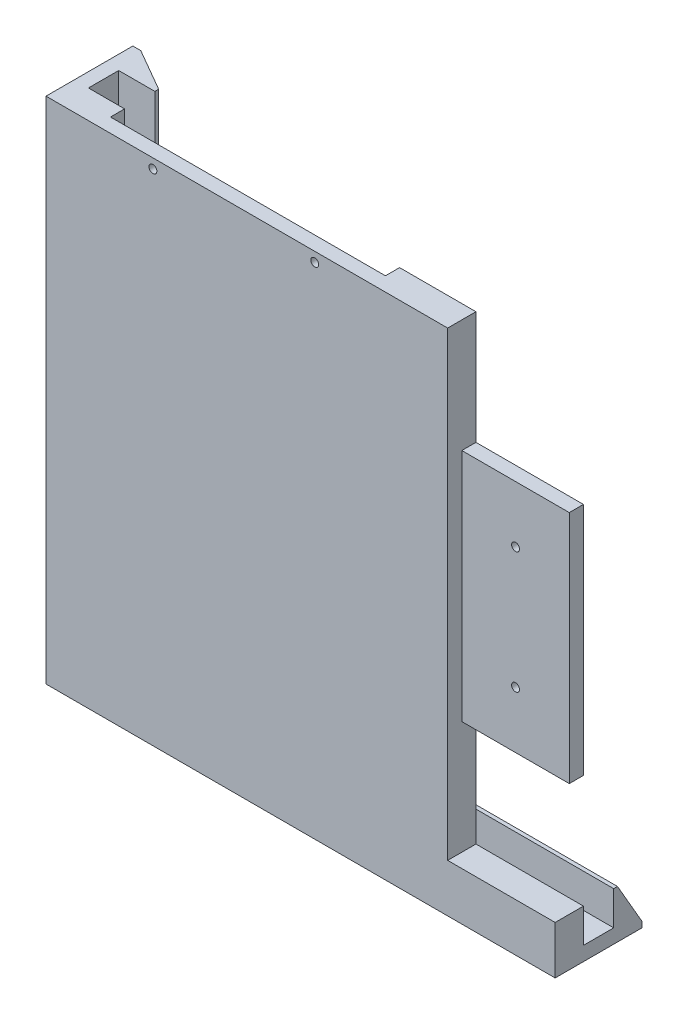
ISO-10303-21;
HEADER;
FILE_DESCRIPTION(('STEP AP214'),'2;1');
FILE_NAME('part.step','',(''),(''),'','','');
FILE_SCHEMA(('AUTOMOTIVE_DESIGN { 1 0 10303 214 1 1 1 1 }'));
ENDSEC;
DATA;
#1=APPLICATION_CONTEXT('core data for automotive mechanical design processes');
#2=APPLICATION_PROTOCOL_DEFINITION('international standard','automotive_design',2000,#1);
#3=PRODUCT_CONTEXT('',#1,'mechanical');
#4=PRODUCT('Part','Part','',(#3));
#5=PRODUCT_RELATED_PRODUCT_CATEGORY('part','',(#4));
#6=PRODUCT_DEFINITION_FORMATION('','',#4);
#7=PRODUCT_DEFINITION_CONTEXT('part definition',#1,'design');
#8=PRODUCT_DEFINITION('design','',#6,#7);
#9=PRODUCT_DEFINITION_SHAPE('','',#8);
#10=(LENGTH_UNIT() NAMED_UNIT(*) SI_UNIT(.MILLI.,.METRE.));
#11=(NAMED_UNIT(*) PLANE_ANGLE_UNIT() SI_UNIT($,.RADIAN.));
#12=(NAMED_UNIT(*) SI_UNIT($,.STERADIAN.) SOLID_ANGLE_UNIT());
#13=UNCERTAINTY_MEASURE_WITH_UNIT(LENGTH_MEASURE(1.E-05),#10,'distance_accuracy_value','');
#14=(GEOMETRIC_REPRESENTATION_CONTEXT(3) GLOBAL_UNCERTAINTY_ASSIGNED_CONTEXT((#13)) GLOBAL_UNIT_ASSIGNED_CONTEXT((#10,
#11,#12)) REPRESENTATION_CONTEXT('',''));
#15=CARTESIAN_POINT('',(0.,0.,0.));
#16=DIRECTION('',(0.,0.,1.));
#17=DIRECTION('',(1.,0.,0.));
#18=AXIS2_PLACEMENT_3D('',#15,#16,#17);
#19=CARTESIAN_POINT('',(180.,0.,30.7));
#20=DIRECTION('',(-1.,0.,0.));
#21=DIRECTION('',(0.,0.,1.));
#22=AXIS2_PLACEMENT_3D('',#19,#20,#21);
#23=PLANE('',#22);
#24=DIRECTION('',(0.,1.,0.));
#25=VECTOR('',#24,1.);
#26=CARTESIAN_POINT('',(180.,0.,0.));
#27=LINE('',#26,#25);
#28=CARTESIAN_POINT('',(180.,0.,0.));
#29=VERTEX_POINT('',#28);
#30=CARTESIAN_POINT('',(180.,2.0099999999999,0.));
#31=VERTEX_POINT('',#30);
#32=EDGE_CURVE('E335',#29,#31,#27,.T.);
#33=ORIENTED_EDGE('',*,*,#32,.T.);
#34=DIRECTION('',(0.,0.86602540378444,0.499999999999997));
#35=VECTOR('',#34,1.);
#36=CARTESIAN_POINT('',(180.,17.01,8.66025403784437));
#37=LINE('',#36,#35);
#38=CARTESIAN_POINT('',(180.,17.01,8.66025403784437));
#39=VERTEX_POINT('',#38);
#40=EDGE_CURVE('E12',#31,#39,#37,.T.);
#41=ORIENTED_EDGE('',*,*,#40,.T.);
#42=DIRECTION('',(0.,0.,-1.));
#43=VECTOR('',#42,1.);
#44=CARTESIAN_POINT('',(180.,17.01,20.7));
#45=LINE('',#44,#43);
#46=CARTESIAN_POINT('',(180.,17.01,10.));
#47=VERTEX_POINT('',#46);
#48=EDGE_CURVE('E309',#47,#39,#45,.T.);
#49=ORIENTED_EDGE('',*,*,#48,.F.);
#50=DIRECTION('',(0.,1.,0.));
#51=VECTOR('',#50,1.);
#52=CARTESIAN_POINT('',(180.,-175.326809130834,10.));
#53=LINE('',#52,#51);
#54=CARTESIAN_POINT('',(180.,5.,10.));
#55=VERTEX_POINT('',#54);
#56=EDGE_CURVE('E292',#55,#47,#53,.T.);
#57=ORIENTED_EDGE('',*,*,#56,.F.);
#58=DIRECTION('',(0.,0.,1.));
#59=VECTOR('',#58,1.);
#60=CARTESIAN_POINT('',(180.,5.,20.7));
#61=LINE('',#60,#59);
#62=CARTESIAN_POINT('',(180.,5.,20.7));
#63=VERTEX_POINT('',#62);
#64=EDGE_CURVE('E284',#55,#63,#61,.T.);
#65=ORIENTED_EDGE('',*,*,#64,.T.);
#66=DIRECTION('',(0.,-1.,0.));
#67=VECTOR('',#66,1.);
#68=CARTESIAN_POINT('',(180.,17.01,20.7));
#69=LINE('',#68,#67);
#70=CARTESIAN_POINT('',(180.,17.01,20.7));
#71=VERTEX_POINT('',#70);
#72=EDGE_CURVE('E303',#71,#63,#69,.T.);
#73=ORIENTED_EDGE('',*,*,#72,.F.);
#74=DIRECTION('',(0.,0.,-1.));
#75=VECTOR('',#74,1.);
#76=CARTESIAN_POINT('',(180.,17.01,30.7));
#77=LINE('',#76,#75);
#78=CARTESIAN_POINT('',(180.,17.01,30.7));
#79=VERTEX_POINT('',#78);
#80=EDGE_CURVE('E274',#79,#71,#77,.T.);
#81=ORIENTED_EDGE('',*,*,#80,.F.);
#82=DIRECTION('',(0.,1.,0.));
#83=VECTOR('',#82,1.);
#84=CARTESIAN_POINT('',(180.,0.,30.7));
#85=LINE('',#84,#83);
#86=CARTESIAN_POINT('',(180.,0.,30.7));
#87=VERTEX_POINT('',#86);
#88=EDGE_CURVE('E325',#87,#79,#85,.T.);
#89=ORIENTED_EDGE('',*,*,#88,.F.);
#90=DIRECTION('',(0.,0.,-1.));
#91=VECTOR('',#90,1.);
#92=CARTESIAN_POINT('',(180.,0.,30.7));
#93=LINE('',#92,#91);
#94=EDGE_CURVE('E340',#87,#29,#93,.T.);
#95=ORIENTED_EDGE('',*,*,#94,.T.);
#96=EDGE_LOOP('',(#33,#41,#49,#57,#65,#73,#81,#89,#95));
#97=FACE_BOUND('',#96,.T.);
#98=ADVANCED_FACE('F41',(#97),#23,.F.);
#99=CARTESIAN_POINT('',(0.,0.,30.7));
#100=DIRECTION('',(1.,0.,0.));
#101=DIRECTION('',(0.,0.,-1.));
#102=AXIS2_PLACEMENT_3D('',#99,#100,#101);
#103=PLANE('',#102);
#104=DIRECTION('',(0.,-1.,0.));
#105=VECTOR('',#104,1.);
#106=CARTESIAN_POINT('',(0.,0.,0.));
#107=LINE('',#106,#105);
#108=CARTESIAN_POINT('',(0.,180.,0.));
#109=VERTEX_POINT('',#108);
#110=CARTESIAN_POINT('',(0.,0.,0.));
#111=VERTEX_POINT('',#110);
#112=EDGE_CURVE('E314',#109,#111,#107,.T.);
#113=ORIENTED_EDGE('',*,*,#112,.T.);
#114=DIRECTION('',(0.,0.,-1.));
#115=VECTOR('',#114,1.);
#116=CARTESIAN_POINT('',(0.,0.,30.7));
#117=LINE('',#116,#115);
#118=CARTESIAN_POINT('',(0.,0.,30.7));
#119=VERTEX_POINT('',#118);
#120=EDGE_CURVE('E343',#119,#111,#117,.T.);
#121=ORIENTED_EDGE('',*,*,#120,.F.);
#122=DIRECTION('',(0.,-1.,0.));
#123=VECTOR('',#122,1.);
#124=CARTESIAN_POINT('',(0.,0.,30.7));
#125=LINE('',#124,#123);
#126=CARTESIAN_POINT('',(0.,180.,30.7));
#127=VERTEX_POINT('',#126);
#128=EDGE_CURVE('E319',#127,#119,#125,.T.);
#129=ORIENTED_EDGE('',*,*,#128,.F.);
#130=DIRECTION('',(0.,0.,-1.));
#131=VECTOR('',#130,1.);
#132=CARTESIAN_POINT('',(0.,180.,30.7));
#133=LINE('',#132,#131);
#134=EDGE_CURVE('E330',#127,#109,#133,.T.);
#135=ORIENTED_EDGE('',*,*,#134,.T.);
#136=EDGE_LOOP('',(#113,#121,#129,#135));
#137=FACE_BOUND('',#136,.T.);
#138=ADVANCED_FACE('F396',(#137),#103,.F.);
#139=CARTESIAN_POINT('',(0.,0.,30.7));
#140=DIRECTION('',(0.,1.,0.));
#141=DIRECTION('',(0.,0.,1.));
#142=AXIS2_PLACEMENT_3D('',#139,#140,#141);
#143=PLANE('',#142);
#144=DIRECTION('',(1.,0.,0.));
#145=VECTOR('',#144,1.);
#146=CARTESIAN_POINT('',(0.,0.,0.));
#147=LINE('',#146,#145);
#148=EDGE_CURVE('E333',#111,#29,#147,.T.);
#149=ORIENTED_EDGE('',*,*,#148,.T.);
#150=ORIENTED_EDGE('',*,*,#94,.F.);
#151=DIRECTION('',(1.,0.,0.));
#152=VECTOR('',#151,1.);
#153=CARTESIAN_POINT('',(0.,0.,30.7));
#154=LINE('',#153,#152);
#155=EDGE_CURVE('E322',#119,#87,#154,.T.);
#156=ORIENTED_EDGE('',*,*,#155,.F.);
#157=ORIENTED_EDGE('',*,*,#120,.T.);
#158=EDGE_LOOP('',(#149,#150,#156,#157));
#159=FACE_BOUND('',#158,.T.);
#160=ADVANCED_FACE('F404',(#159),#143,.F.);
#161=DIRECTION('',(0.,0.,-1.));
#162=VECTOR('',#161,1.);
#163=CARTESIAN_POINT('',(180.,140.,30.7));
#164=LINE('',#163,#162);
#165=CARTESIAN_POINT('',(180.,140.,25.7));
#166=VERTEX_POINT('',#165);
#167=CARTESIAN_POINT('',(180.,140.,20.7));
#168=VERTEX_POINT('',#167);
#169=EDGE_CURVE('E257',#166,#168,#164,.T.);
#170=ORIENTED_EDGE('',*,*,#169,.F.);
#171=DIRECTION('',(0.,1.,0.));
#172=VECTOR('',#171,1.);
#173=CARTESIAN_POINT('',(180.,140.,25.7));
#174=LINE('',#173,#172);
#175=CARTESIAN_POINT('',(180.,57.0100000000001,25.7));
#176=VERTEX_POINT('',#175);
#177=EDGE_CURVE('E229',#176,#166,#174,.T.);
#178=ORIENTED_EDGE('',*,*,#177,.F.);
#179=DIRECTION('',(0.,0.,-1.));
#180=VECTOR('',#179,1.);
#181=CARTESIAN_POINT('',(180.,57.0100000000001,30.7));
#182=LINE('',#181,#180);
#183=CARTESIAN_POINT('',(180.,57.0100000000001,20.7));
#184=VERTEX_POINT('',#183);
#185=EDGE_CURVE('E276',#176,#184,#182,.T.);
#186=ORIENTED_EDGE('',*,*,#185,.T.);
#187=EDGE_CURVE('E305',#168,#184,#69,.T.);
#188=ORIENTED_EDGE('',*,*,#187,.F.);
#189=EDGE_LOOP('',(#170,#178,#186,#188));
#190=FACE_BOUND('',#189,.T.);
#191=ADVANCED_FACE('F398',(#190),#23,.F.);
#192=CARTESIAN_POINT('',(0.,180.,30.7));
#193=DIRECTION('',(0.,-1.,0.));
#194=DIRECTION('',(0.,0.,-1.));
#195=AXIS2_PLACEMENT_3D('',#192,#193,#194);
#196=PLANE('',#195);
#197=DIRECTION('',(0.,0.,-1.));
#198=VECTOR('',#197,1.);
#199=CARTESIAN_POINT('',(17.79,180.,20.7));
#200=LINE('',#199,#198);
#201=CARTESIAN_POINT('',(17.79,180.,10.));
#202=VERTEX_POINT('',#201);
#203=CARTESIAN_POINT('',(17.79,180.,8.66025403784437));
#204=VERTEX_POINT('',#203);
#205=EDGE_CURVE('E311',#202,#204,#200,.T.);
#206=ORIENTED_EDGE('',*,*,#205,.T.);
#207=DIRECTION('',(-0.86602540378444,0.,-0.499999999999997));
#208=VECTOR('',#207,1.);
#209=CARTESIAN_POINT('',(17.79,180.,8.66025403784437));
#210=LINE('',#209,#208);
#211=CARTESIAN_POINT('',(2.7899999999999,180.,0.));
#212=VERTEX_POINT('',#211);
#213=EDGE_CURVE('E352',#204,#212,#210,.T.);
#214=ORIENTED_EDGE('',*,*,#213,.T.);
#215=DIRECTION('',(-1.,0.,0.));
#216=VECTOR('',#215,1.);
#217=CARTESIAN_POINT('',(0.,180.,0.));
#218=LINE('',#217,#216);
#219=EDGE_CURVE('E323',#212,#109,#218,.T.);
#220=ORIENTED_EDGE('',*,*,#219,.T.);
#221=ORIENTED_EDGE('',*,*,#134,.F.);
#222=DIRECTION('',(-1.,0.,0.));
#223=VECTOR('',#222,1.);
#224=CARTESIAN_POINT('',(0.,180.,30.7));
#225=LINE('',#224,#223);
#226=CARTESIAN_POINT('',(142.,180.,30.7));
#227=VERTEX_POINT('',#226);
#228=EDGE_CURVE('E328',#227,#127,#225,.T.);
#229=ORIENTED_EDGE('',*,*,#228,.F.);
#230=DIRECTION('',(0.,0.,-1.));
#231=VECTOR('',#230,1.);
#232=CARTESIAN_POINT('',(142.,180.,30.7));
#233=LINE('',#232,#231);
#234=CARTESIAN_POINT('',(142.,180.,20.7));
#235=VERTEX_POINT('',#234);
#236=EDGE_CURVE('E246',#227,#235,#233,.T.);
#237=ORIENTED_EDGE('',*,*,#236,.T.);
#238=DIRECTION('',(1.,0.,0.));
#239=VECTOR('',#238,1.);
#240=CARTESIAN_POINT('',(180.,180.,20.7));
#241=LINE('',#240,#239);
#242=CARTESIAN_POINT('',(115.,180.,20.7));
#243=VERTEX_POINT('',#242);
#244=EDGE_CURVE('E310',#243,#235,#241,.T.);
#245=ORIENTED_EDGE('',*,*,#244,.F.);
#246=DIRECTION('',(0.,0.,-1.));
#247=VECTOR('',#246,1.);
#248=CARTESIAN_POINT('',(115.,180.,25.7));
#249=LINE('',#248,#247);
#250=CARTESIAN_POINT('',(115.,180.,25.7));
#251=VERTEX_POINT('',#250);
#252=EDGE_CURVE('E227',#251,#243,#249,.T.);
#253=ORIENTED_EDGE('',*,*,#252,.F.);
#254=DIRECTION('',(1.,0.,0.));
#255=VECTOR('',#254,1.);
#256=CARTESIAN_POINT('',(115.,180.,25.7));
#257=LINE('',#256,#255);
#258=CARTESIAN_POINT('',(17.79,180.,25.7));
#259=VERTEX_POINT('',#258);
#260=EDGE_CURVE('E201',#259,#251,#257,.T.);
#261=ORIENTED_EDGE('',*,*,#260,.F.);
#262=DIRECTION('',(0.,0.,-1.));
#263=VECTOR('',#262,1.);
#264=CARTESIAN_POINT('',(17.79,180.,25.7));
#265=LINE('',#264,#263);
#266=CARTESIAN_POINT('',(17.79,180.,20.7));
#267=VERTEX_POINT('',#266);
#268=EDGE_CURVE('E230',#259,#267,#265,.T.);
#269=ORIENTED_EDGE('',*,*,#268,.T.);
#270=CARTESIAN_POINT('',(5.,180.,20.7));
#271=VERTEX_POINT('',#270);
#272=EDGE_CURVE('E306',#271,#267,#241,.T.);
#273=ORIENTED_EDGE('',*,*,#272,.F.);
#274=DIRECTION('',(0.,0.,1.));
#275=VECTOR('',#274,1.);
#276=CARTESIAN_POINT('',(5.,180.,20.7));
#277=LINE('',#276,#275);
#278=CARTESIAN_POINT('',(5.,180.,10.));
#279=VERTEX_POINT('',#278);
#280=EDGE_CURVE('E289',#279,#271,#277,.T.);
#281=ORIENTED_EDGE('',*,*,#280,.F.);
#282=DIRECTION('',(-1.,0.,0.));
#283=VECTOR('',#282,1.);
#284=CARTESIAN_POINT('',(180.,180.,10.));
#285=LINE('',#284,#283);
#286=EDGE_CURVE('E256',#202,#279,#285,.T.);
#287=ORIENTED_EDGE('',*,*,#286,.F.);
#288=EDGE_LOOP('',(#206,#214,#220,#221,#229,#237,#245,#253,#261,#269,#273,#281,#287));
#289=FACE_BOUND('',#288,.T.);
#290=ADVANCED_FACE('F410',(#289),#196,.F.);
#291=CARTESIAN_POINT('',(0.,0.,30.7));
#292=DIRECTION('',(0.,0.,-1.));
#293=DIRECTION('',(-1.,0.,0.));
#294=AXIS2_PLACEMENT_3D('',#291,#292,#293);
#295=PLANE('',#294);
#296=CARTESIAN_POINT('',(37.79,176.6,30.7));
#297=DIRECTION('',(0.,0.,-1.));
#298=DIRECTION('',(-1.,0.,0.));
#299=AXIS2_PLACEMENT_3D('',#296,#297,#298);
#300=CIRCLE('',#299,1.40000000000001);
#301=CARTESIAN_POINT('',(36.39,176.6,30.7));
#302=VERTEX_POINT('',#301);
#303=EDGE_CURVE('E219',#302,#302,#300,.T.);
#304=ORIENTED_EDGE('',*,*,#303,.T.);
#305=EDGE_LOOP('',(#304));
#306=FACE_BOUND('',#305,.T.);
#307=CARTESIAN_POINT('',(95.,176.6,30.7));
#308=DIRECTION('',(0.,0.,-1.));
#309=DIRECTION('',(-1.,0.,0.));
#310=AXIS2_PLACEMENT_3D('',#307,#308,#309);
#311=CIRCLE('',#310,1.40000000000002);
#312=CARTESIAN_POINT('',(93.6,176.6,30.7));
#313=VERTEX_POINT('',#312);
#314=EDGE_CURVE('E363',#313,#313,#311,.T.);
#315=ORIENTED_EDGE('',*,*,#314,.T.);
#316=EDGE_LOOP('',(#315));
#317=FACE_BOUND('',#316,.T.);
#318=DIRECTION('',(-1.,0.,0.));
#319=VECTOR('',#318,1.);
#320=CARTESIAN_POINT('',(142.,17.01,30.7));
#321=LINE('',#320,#319);
#322=CARTESIAN_POINT('',(142.,17.01,30.7));
#323=VERTEX_POINT('',#322);
#324=EDGE_CURVE('E261',#79,#323,#321,.T.);
#325=ORIENTED_EDGE('',*,*,#324,.T.);
#326=DIRECTION('',(0.,1.,0.));
#327=VECTOR('',#326,1.);
#328=CARTESIAN_POINT('',(142.,140.,30.7));
#329=LINE('',#328,#327);
#330=EDGE_CURVE('E243',#323,#227,#329,.T.);
#331=ORIENTED_EDGE('',*,*,#330,.T.);
#332=ORIENTED_EDGE('',*,*,#228,.T.);
#333=ORIENTED_EDGE('',*,*,#128,.T.);
#334=ORIENTED_EDGE('',*,*,#155,.T.);
#335=ORIENTED_EDGE('',*,*,#88,.T.);
#336=EDGE_LOOP('',(#325,#331,#332,#333,#334,#335));
#337=FACE_BOUND('',#336,.T.);
#338=ADVANCED_FACE('F375',(#306,#317,#337),#295,.F.);
#339=CARTESIAN_POINT('',(0.,0.,0.));
#340=DIRECTION('',(0.,0.,-1.));
#341=DIRECTION('',(-1.,0.,0.));
#342=AXIS2_PLACEMENT_3D('',#339,#340,#341);
#343=PLANE('',#342);
#344=ORIENTED_EDGE('',*,*,#219,.F.);
#345=DIRECTION('',(0.,-1.,0.));
#346=VECTOR('',#345,1.);
#347=CARTESIAN_POINT('',(2.7899999999999,17.01,0.));
#348=LINE('',#347,#346);
#349=CARTESIAN_POINT('',(2.7899999999999,2.0099999999999,0.));
#350=VERTEX_POINT('',#349);
#351=EDGE_CURVE('E64',#212,#350,#348,.T.);
#352=ORIENTED_EDGE('',*,*,#351,.T.);
#353=DIRECTION('',(1.,0.,0.));
#354=VECTOR('',#353,1.);
#355=CARTESIAN_POINT('',(180.,2.0099999999999,0.));
#356=LINE('',#355,#354);
#357=EDGE_CURVE('E354',#350,#31,#356,.T.);
#358=ORIENTED_EDGE('',*,*,#357,.T.);
#359=ORIENTED_EDGE('',*,*,#32,.F.);
#360=ORIENTED_EDGE('',*,*,#148,.F.);
#361=ORIENTED_EDGE('',*,*,#112,.F.);
#362=EDGE_LOOP('',(#344,#352,#358,#359,#360,#361));
#363=FACE_BOUND('',#362,.T.);
#364=ADVANCED_FACE('F492',(#363),#343,.T.);
#365=CARTESIAN_POINT('',(17.79,17.01,20.7));
#366=DIRECTION('',(-1.,0.,0.));
#367=DIRECTION('',(0.,0.,1.));
#368=AXIS2_PLACEMENT_3D('',#365,#366,#367);
#369=PLANE('',#368);
#370=DIRECTION('',(0.,0.,-1.));
#371=VECTOR('',#370,1.);
#372=CARTESIAN_POINT('',(17.79,17.01,20.7));
#373=LINE('',#372,#371);
#374=CARTESIAN_POINT('',(17.79,17.01,10.));
#375=VERTEX_POINT('',#374);
#376=CARTESIAN_POINT('',(17.79,17.01,8.66025403784437));
#377=VERTEX_POINT('',#376);
#378=EDGE_CURVE('E315',#375,#377,#373,.T.);
#379=ORIENTED_EDGE('',*,*,#378,.T.);
#380=DIRECTION('',(0.,1.,0.));
#381=VECTOR('',#380,1.);
#382=CARTESIAN_POINT('',(17.79,180.,8.66025403784437));
#383=LINE('',#382,#381);
#384=EDGE_CURVE('E349',#377,#204,#383,.T.);
#385=ORIENTED_EDGE('',*,*,#384,.T.);
#386=ORIENTED_EDGE('',*,*,#205,.F.);
#387=DIRECTION('',(0.,-1.,0.));
#388=VECTOR('',#387,1.);
#389=CARTESIAN_POINT('',(17.79,17.01,10.));
#390=LINE('',#389,#388);
#391=EDGE_CURVE('E300',#202,#375,#390,.T.);
#392=ORIENTED_EDGE('',*,*,#391,.T.);
#393=EDGE_LOOP('',(#379,#385,#386,#392));
#394=FACE_BOUND('',#393,.T.);
#395=ADVANCED_FACE('F489',(#394),#369,.F.);
#396=CARTESIAN_POINT('',(180.,17.01,20.7));
#397=DIRECTION('',(0.,-1.,0.));
#398=DIRECTION('',(0.,0.,-1.));
#399=AXIS2_PLACEMENT_3D('',#396,#397,#398);
#400=PLANE('',#399);
#401=ORIENTED_EDGE('',*,*,#48,.T.);
#402=DIRECTION('',(-1.,0.,0.));
#403=VECTOR('',#402,1.);
#404=CARTESIAN_POINT('',(17.79,17.01,8.66025403784437));
#405=LINE('',#404,#403);
#406=EDGE_CURVE('E50',#39,#377,#405,.T.);
#407=ORIENTED_EDGE('',*,*,#406,.T.);
#408=ORIENTED_EDGE('',*,*,#378,.F.);
#409=DIRECTION('',(1.,0.,0.));
#410=VECTOR('',#409,1.);
#411=CARTESIAN_POINT('',(180.,17.01,10.));
#412=LINE('',#411,#410);
#413=EDGE_CURVE('E346',#375,#47,#412,.T.);
#414=ORIENTED_EDGE('',*,*,#413,.T.);
#415=EDGE_LOOP('',(#401,#407,#408,#414));
#416=FACE_BOUND('',#415,.T.);
#417=ADVANCED_FACE('F487',(#416),#400,.F.);
#418=CARTESIAN_POINT('',(0.,0.,20.7));
#419=DIRECTION('',(0.,0.,1.));
#420=DIRECTION('',(1.,0.,0.));
#421=AXIS2_PLACEMENT_3D('',#418,#419,#420);
#422=PLANE('',#421);
#423=CARTESIAN_POINT('',(161.,120.,20.7));
#424=DIRECTION('',(0.,0.,-1.));
#425=DIRECTION('',(-1.,0.,0.));
#426=AXIS2_PLACEMENT_3D('',#423,#424,#425);
#427=CIRCLE('',#426,1.4);
#428=CARTESIAN_POINT('',(159.6,120.,20.7));
#429=VERTEX_POINT('',#428);
#430=EDGE_CURVE('E364',#429,#429,#427,.T.);
#431=ORIENTED_EDGE('',*,*,#430,.F.);
#432=EDGE_LOOP('',(#431));
#433=FACE_BOUND('',#432,.T.);
#434=CARTESIAN_POINT('',(161.,77.0100000000001,20.7));
#435=DIRECTION('',(0.,0.,-1.));
#436=DIRECTION('',(-1.,0.,0.));
#437=AXIS2_PLACEMENT_3D('',#434,#435,#436);
#438=CIRCLE('',#437,1.40000000000003);
#439=CARTESIAN_POINT('',(159.6,77.0100000000001,20.7));
#440=VERTEX_POINT('',#439);
#441=EDGE_CURVE('E539',#440,#440,#438,.T.);
#442=ORIENTED_EDGE('',*,*,#441,.F.);
#443=EDGE_LOOP('',(#442));
#444=FACE_BOUND('',#443,.T.);
#445=DIRECTION('',(-1.,0.,0.));
#446=VECTOR('',#445,1.);
#447=CARTESIAN_POINT('',(115.,173.2,20.7));
#448=LINE('',#447,#446);
#449=CARTESIAN_POINT('',(115.,173.2,20.7));
#450=VERTEX_POINT('',#449);
#451=CARTESIAN_POINT('',(17.79,173.2,20.7));
#452=VERTEX_POINT('',#451);
#453=EDGE_CURVE('E216',#450,#452,#448,.T.);
#454=ORIENTED_EDGE('',*,*,#453,.F.);
#455=DIRECTION('',(0.,-1.,0.));
#456=VECTOR('',#455,1.);
#457=CARTESIAN_POINT('',(115.,173.2,20.7));
#458=LINE('',#457,#456);
#459=EDGE_CURVE('E196',#243,#450,#458,.T.);
#460=ORIENTED_EDGE('',*,*,#459,.F.);
#461=ORIENTED_EDGE('',*,*,#244,.T.);
#462=DIRECTION('',(0.,1.,0.));
#463=VECTOR('',#462,1.);
#464=CARTESIAN_POINT('',(142.,140.,20.7));
#465=LINE('',#464,#463);
#466=CARTESIAN_POINT('',(142.,140.,20.7));
#467=VERTEX_POINT('',#466);
#468=EDGE_CURVE('E248',#467,#235,#465,.T.);
#469=ORIENTED_EDGE('',*,*,#468,.F.);
#470=DIRECTION('',(-1.,0.,0.));
#471=VECTOR('',#470,1.);
#472=CARTESIAN_POINT('',(142.,140.,20.7));
#473=LINE('',#472,#471);
#474=EDGE_CURVE('E247',#168,#467,#473,.T.);
#475=ORIENTED_EDGE('',*,*,#474,.F.);
#476=ORIENTED_EDGE('',*,*,#187,.T.);
#477=DIRECTION('',(1.,0.,0.));
#478=VECTOR('',#477,1.);
#479=CARTESIAN_POINT('',(142.,57.0100000000001,20.7));
#480=LINE('',#479,#478);
#481=CARTESIAN_POINT('',(142.,57.0100000000001,20.7));
#482=VERTEX_POINT('',#481);
#483=EDGE_CURVE('E268',#482,#184,#480,.T.);
#484=ORIENTED_EDGE('',*,*,#483,.F.);
#485=DIRECTION('',(0.,1.,0.));
#486=VECTOR('',#485,1.);
#487=CARTESIAN_POINT('',(142.,57.0100000000001,20.7));
#488=LINE('',#487,#486);
#489=CARTESIAN_POINT('',(142.,17.01,20.7));
#490=VERTEX_POINT('',#489);
#491=EDGE_CURVE('E242',#490,#482,#488,.T.);
#492=ORIENTED_EDGE('',*,*,#491,.F.);
#493=DIRECTION('',(-1.,0.,0.));
#494=VECTOR('',#493,1.);
#495=CARTESIAN_POINT('',(142.,17.01,20.7));
#496=LINE('',#495,#494);
#497=EDGE_CURVE('E265',#71,#490,#496,.T.);
#498=ORIENTED_EDGE('',*,*,#497,.F.);
#499=ORIENTED_EDGE('',*,*,#72,.T.);
#500=DIRECTION('',(-1.,0.,0.));
#501=VECTOR('',#500,1.);
#502=CARTESIAN_POINT('',(180.,5.,20.7));
#503=LINE('',#502,#501);
#504=CARTESIAN_POINT('',(5.,5.,20.7));
#505=VERTEX_POINT('',#504);
#506=EDGE_CURVE('E281',#63,#505,#503,.T.);
#507=ORIENTED_EDGE('',*,*,#506,.T.);
#508=DIRECTION('',(0.,1.,0.));
#509=VECTOR('',#508,1.);
#510=CARTESIAN_POINT('',(5.,-175.326809130834,20.7));
#511=LINE('',#510,#509);
#512=EDGE_CURVE('E282',#505,#271,#511,.T.);
#513=ORIENTED_EDGE('',*,*,#512,.T.);
#514=ORIENTED_EDGE('',*,*,#272,.T.);
#515=DIRECTION('',(0.,1.,0.));
#516=VECTOR('',#515,1.);
#517=CARTESIAN_POINT('',(17.79,173.2,20.7));
#518=LINE('',#517,#516);
#519=EDGE_CURVE('E214',#452,#267,#518,.T.);
#520=ORIENTED_EDGE('',*,*,#519,.F.);
#521=EDGE_LOOP('',(#454,#460,#461,#469,#475,#476,#484,#492,#498,#499,#507,#513,#514,#520));
#522=FACE_BOUND('',#521,.T.);
#523=ADVANCED_FACE('F431',(#433,#444,#522),#422,.F.);
#524=CARTESIAN_POINT('',(180.,-175.326809130834,10.));
#525=DIRECTION('',(0.,0.,-1.));
#526=DIRECTION('',(-1.,0.,0.));
#527=AXIS2_PLACEMENT_3D('',#524,#525,#526);
#528=PLANE('',#527);
#529=ORIENTED_EDGE('',*,*,#286,.T.);
#530=DIRECTION('',(0.,1.,0.));
#531=VECTOR('',#530,1.);
#532=CARTESIAN_POINT('',(5.,-175.326809130834,10.));
#533=LINE('',#532,#531);
#534=CARTESIAN_POINT('',(5.,4.99999999999995,10.));
#535=VERTEX_POINT('',#534);
#536=EDGE_CURVE('E295',#535,#279,#533,.T.);
#537=ORIENTED_EDGE('',*,*,#536,.F.);
#538=DIRECTION('',(1.,0.,0.));
#539=VECTOR('',#538,1.);
#540=CARTESIAN_POINT('',(180.,5.,10.));
#541=LINE('',#540,#539);
#542=EDGE_CURVE('E287',#535,#55,#541,.T.);
#543=ORIENTED_EDGE('',*,*,#542,.T.);
#544=ORIENTED_EDGE('',*,*,#56,.T.);
#545=ORIENTED_EDGE('',*,*,#413,.F.);
#546=ORIENTED_EDGE('',*,*,#391,.F.);
#547=EDGE_LOOP('',(#529,#537,#543,#544,#545,#546));
#548=FACE_BOUND('',#547,.T.);
#549=ADVANCED_FACE('F481',(#548),#528,.F.);
#550=CARTESIAN_POINT('',(5.,-175.326809130834,20.7));
#551=DIRECTION('',(-1.,0.,0.));
#552=DIRECTION('',(0.,0.,1.));
#553=AXIS2_PLACEMENT_3D('',#550,#551,#552);
#554=PLANE('',#553);
#555=DIRECTION('',(0.,0.,-1.));
#556=VECTOR('',#555,1.);
#557=CARTESIAN_POINT('',(5.,5.,20.7));
#558=LINE('',#557,#556);
#559=EDGE_CURVE('E279',#505,#535,#558,.T.);
#560=ORIENTED_EDGE('',*,*,#559,.T.);
#561=ORIENTED_EDGE('',*,*,#536,.T.);
#562=ORIENTED_EDGE('',*,*,#280,.T.);
#563=ORIENTED_EDGE('',*,*,#512,.F.);
#564=EDGE_LOOP('',(#560,#561,#562,#563));
#565=FACE_BOUND('',#564,.T.);
#566=ADVANCED_FACE('F477',(#565),#554,.F.);
#567=CARTESIAN_POINT('',(0.,5.,30.7));
#568=DIRECTION('',(0.,1.,0.));
#569=DIRECTION('',(0.,0.,1.));
#570=AXIS2_PLACEMENT_3D('',#567,#568,#569);
#571=PLANE('',#570);
#572=ORIENTED_EDGE('',*,*,#64,.F.);
#573=ORIENTED_EDGE('',*,*,#542,.F.);
#574=ORIENTED_EDGE('',*,*,#559,.F.);
#575=ORIENTED_EDGE('',*,*,#506,.F.);
#576=EDGE_LOOP('',(#572,#573,#574,#575));
#577=FACE_BOUND('',#576,.T.);
#578=ADVANCED_FACE('F472',(#577),#571,.T.);
#579=CARTESIAN_POINT('',(142.,17.01,30.7));
#580=DIRECTION('',(0.,-1.,0.));
#581=DIRECTION('',(0.,0.,-1.));
#582=AXIS2_PLACEMENT_3D('',#579,#580,#581);
#583=PLANE('',#582);
#584=ORIENTED_EDGE('',*,*,#497,.T.);
#585=DIRECTION('',(0.,0.,-1.));
#586=VECTOR('',#585,1.);
#587=CARTESIAN_POINT('',(142.,17.01,30.7));
#588=LINE('',#587,#586);
#589=EDGE_CURVE('E251',#323,#490,#588,.T.);
#590=ORIENTED_EDGE('',*,*,#589,.F.);
#591=ORIENTED_EDGE('',*,*,#324,.F.);
#592=ORIENTED_EDGE('',*,*,#80,.T.);
#593=EDGE_LOOP('',(#584,#590,#591,#592));
#594=FACE_BOUND('',#593,.T.);
#595=ADVANCED_FACE('F443',(#594),#583,.F.);
#596=CARTESIAN_POINT('',(142.,57.0100000000001,30.7));
#597=DIRECTION('',(0.,1.,0.));
#598=DIRECTION('',(0.,0.,1.));
#599=AXIS2_PLACEMENT_3D('',#596,#597,#598);
#600=PLANE('',#599);
#601=ORIENTED_EDGE('',*,*,#185,.F.);
#602=DIRECTION('',(1.,0.,0.));
#603=VECTOR('',#602,1.);
#604=CARTESIAN_POINT('',(180.,57.0100000000001,25.7));
#605=LINE('',#604,#603);
#606=CARTESIAN_POINT('',(142.,57.0100000000001,25.7));
#607=VERTEX_POINT('',#606);
#608=EDGE_CURVE('E240',#607,#176,#605,.T.);
#609=ORIENTED_EDGE('',*,*,#608,.F.);
#610=DIRECTION('',(0.,0.,-1.));
#611=VECTOR('',#610,1.);
#612=CARTESIAN_POINT('',(142.,57.0100000000001,30.7));
#613=LINE('',#612,#611);
#614=EDGE_CURVE('E264',#607,#482,#613,.T.);
#615=ORIENTED_EDGE('',*,*,#614,.T.);
#616=ORIENTED_EDGE('',*,*,#483,.T.);
#617=EDGE_LOOP('',(#601,#609,#615,#616));
#618=FACE_BOUND('',#617,.T.);
#619=ADVANCED_FACE('F451',(#618),#600,.F.);
#620=CARTESIAN_POINT('',(142.,140.,30.7));
#621=DIRECTION('',(-1.,0.,0.));
#622=DIRECTION('',(0.,0.,1.));
#623=AXIS2_PLACEMENT_3D('',#620,#621,#622);
#624=PLANE('',#623);
#625=ORIENTED_EDGE('',*,*,#468,.T.);
#626=ORIENTED_EDGE('',*,*,#236,.F.);
#627=ORIENTED_EDGE('',*,*,#330,.F.);
#628=ORIENTED_EDGE('',*,*,#589,.T.);
#629=ORIENTED_EDGE('',*,*,#491,.T.);
#630=ORIENTED_EDGE('',*,*,#614,.F.);
#631=DIRECTION('',(0.,-1.,0.));
#632=VECTOR('',#631,1.);
#633=CARTESIAN_POINT('',(142.,140.,25.7));
#634=LINE('',#633,#632);
#635=CARTESIAN_POINT('',(142.,140.,25.7));
#636=VERTEX_POINT('',#635);
#637=EDGE_CURVE('E238',#636,#607,#634,.T.);
#638=ORIENTED_EDGE('',*,*,#637,.F.);
#639=DIRECTION('',(0.,0.,-1.));
#640=VECTOR('',#639,1.);
#641=CARTESIAN_POINT('',(142.,140.,30.7));
#642=LINE('',#641,#640);
#643=EDGE_CURVE('E254',#636,#467,#642,.T.);
#644=ORIENTED_EDGE('',*,*,#643,.T.);
#645=EDGE_LOOP('',(#625,#626,#627,#628,#629,#630,#638,#644));
#646=FACE_BOUND('',#645,.T.);
#647=ADVANCED_FACE('F435',(#646),#624,.F.);
#648=CARTESIAN_POINT('',(142.,140.,30.7));
#649=DIRECTION('',(0.,-1.,0.));
#650=DIRECTION('',(0.,0.,-1.));
#651=AXIS2_PLACEMENT_3D('',#648,#649,#650);
#652=PLANE('',#651);
#653=ORIENTED_EDGE('',*,*,#643,.F.);
#654=DIRECTION('',(-1.,0.,0.));
#655=VECTOR('',#654,1.);
#656=CARTESIAN_POINT('',(180.,140.,25.7));
#657=LINE('',#656,#655);
#658=EDGE_CURVE('E235',#166,#636,#657,.T.);
#659=ORIENTED_EDGE('',*,*,#658,.F.);
#660=ORIENTED_EDGE('',*,*,#169,.T.);
#661=ORIENTED_EDGE('',*,*,#474,.T.);
#662=EDGE_LOOP('',(#653,#659,#660,#661));
#663=FACE_BOUND('',#662,.T.);
#664=ADVANCED_FACE('F428',(#663),#652,.F.);
#665=CARTESIAN_POINT('',(0.,0.,25.7));
#666=DIRECTION('',(0.,0.,-1.));
#667=DIRECTION('',(-1.,0.,0.));
#668=AXIS2_PLACEMENT_3D('',#665,#666,#667);
#669=PLANE('',#668);
#670=CARTESIAN_POINT('',(161.,120.,25.7));
#671=DIRECTION('',(0.,0.,-1.));
#672=DIRECTION('',(-1.,0.,0.));
#673=AXIS2_PLACEMENT_3D('',#670,#671,#672);
#674=CIRCLE('',#673,1.4);
#675=CARTESIAN_POINT('',(159.6,120.,25.7));
#676=VERTEX_POINT('',#675);
#677=EDGE_CURVE('E45',#676,#676,#674,.T.);
#678=ORIENTED_EDGE('',*,*,#677,.T.);
#679=EDGE_LOOP('',(#678));
#680=FACE_BOUND('',#679,.T.);
#681=CARTESIAN_POINT('',(161.,77.0100000000001,25.7));
#682=DIRECTION('',(0.,0.,-1.));
#683=DIRECTION('',(-1.,0.,0.));
#684=AXIS2_PLACEMENT_3D('',#681,#682,#683);
#685=CIRCLE('',#684,1.40000000000003);
#686=CARTESIAN_POINT('',(159.6,77.0100000000001,25.7));
#687=VERTEX_POINT('',#686);
#688=EDGE_CURVE('E367',#687,#687,#685,.T.);
#689=ORIENTED_EDGE('',*,*,#688,.T.);
#690=EDGE_LOOP('',(#689));
#691=FACE_BOUND('',#690,.T.);
#692=ORIENTED_EDGE('',*,*,#177,.T.);
#693=ORIENTED_EDGE('',*,*,#658,.T.);
#694=ORIENTED_EDGE('',*,*,#637,.T.);
#695=ORIENTED_EDGE('',*,*,#608,.T.);
#696=EDGE_LOOP('',(#692,#693,#694,#695));
#697=FACE_BOUND('',#696,.T.);
#698=ADVANCED_FACE('F453',(#680,#691,#697),#669,.F.);
#699=CARTESIAN_POINT('',(115.,173.2,25.7));
#700=DIRECTION('',(1.,0.,0.));
#701=DIRECTION('',(0.,0.,-1.));
#702=AXIS2_PLACEMENT_3D('',#699,#700,#701);
#703=PLANE('',#702);
#704=ORIENTED_EDGE('',*,*,#459,.T.);
#705=DIRECTION('',(0.,0.,-1.));
#706=VECTOR('',#705,1.);
#707=CARTESIAN_POINT('',(115.,173.2,25.7));
#708=LINE('',#707,#706);
#709=CARTESIAN_POINT('',(115.,173.2,25.7));
#710=VERTEX_POINT('',#709);
#711=EDGE_CURVE('E189',#710,#450,#708,.T.);
#712=ORIENTED_EDGE('',*,*,#711,.F.);
#713=DIRECTION('',(0.,-1.,0.));
#714=VECTOR('',#713,1.);
#715=CARTESIAN_POINT('',(115.,173.2,25.7));
#716=LINE('',#715,#714);
#717=EDGE_CURVE('E193',#251,#710,#716,.T.);
#718=ORIENTED_EDGE('',*,*,#717,.F.);
#719=ORIENTED_EDGE('',*,*,#252,.T.);
#720=EDGE_LOOP('',(#704,#712,#718,#719));
#721=FACE_BOUND('',#720,.T.);
#722=ADVANCED_FACE('F191',(#721),#703,.F.);
#723=CARTESIAN_POINT('',(17.79,173.2,25.7));
#724=DIRECTION('',(-1.,0.,0.));
#725=DIRECTION('',(0.,0.,1.));
#726=AXIS2_PLACEMENT_3D('',#723,#724,#725);
#727=PLANE('',#726);
#728=ORIENTED_EDGE('',*,*,#519,.T.);
#729=ORIENTED_EDGE('',*,*,#268,.F.);
#730=DIRECTION('',(0.,1.,0.));
#731=VECTOR('',#730,1.);
#732=CARTESIAN_POINT('',(17.79,173.2,25.7));
#733=LINE('',#732,#731);
#734=CARTESIAN_POINT('',(17.79,173.2,25.7));
#735=VERTEX_POINT('',#734);
#736=EDGE_CURVE('E209',#735,#259,#733,.T.);
#737=ORIENTED_EDGE('',*,*,#736,.F.);
#738=DIRECTION('',(0.,0.,-1.));
#739=VECTOR('',#738,1.);
#740=CARTESIAN_POINT('',(17.79,173.2,25.7));
#741=LINE('',#740,#739);
#742=EDGE_CURVE('E200',#735,#452,#741,.T.);
#743=ORIENTED_EDGE('',*,*,#742,.T.);
#744=EDGE_LOOP('',(#728,#729,#737,#743));
#745=FACE_BOUND('',#744,.T.);
#746=ADVANCED_FACE('F462',(#745),#727,.F.);
#747=CARTESIAN_POINT('',(115.,173.2,25.7));
#748=DIRECTION('',(0.,-1.,0.));
#749=DIRECTION('',(0.,0.,-1.));
#750=AXIS2_PLACEMENT_3D('',#747,#748,#749);
#751=PLANE('',#750);
#752=ORIENTED_EDGE('',*,*,#453,.T.);
#753=ORIENTED_EDGE('',*,*,#742,.F.);
#754=DIRECTION('',(-1.,0.,0.));
#755=VECTOR('',#754,1.);
#756=CARTESIAN_POINT('',(115.,173.2,25.7));
#757=LINE('',#756,#755);
#758=EDGE_CURVE('E204',#710,#735,#757,.T.);
#759=ORIENTED_EDGE('',*,*,#758,.F.);
#760=ORIENTED_EDGE('',*,*,#711,.T.);
#761=EDGE_LOOP('',(#752,#753,#759,#760));
#762=FACE_BOUND('',#761,.T.);
#763=ADVANCED_FACE('F205',(#762),#751,.F.);
#764=CARTESIAN_POINT('',(0.,0.,25.7));
#765=DIRECTION('',(0.,0.,1.));
#766=DIRECTION('',(1.,0.,0.));
#767=AXIS2_PLACEMENT_3D('',#764,#765,#766);
#768=PLANE('',#767);
#769=CARTESIAN_POINT('',(37.79,176.6,25.7));
#770=DIRECTION('',(0.,0.,1.));
#771=DIRECTION('',(1.,0.,0.));
#772=AXIS2_PLACEMENT_3D('',#769,#770,#771);
#773=CIRCLE('',#772,1.40000000000001);
#774=CARTESIAN_POINT('',(39.1900000000001,176.6,25.7));
#775=VERTEX_POINT('',#774);
#776=EDGE_CURVE('E365',#775,#775,#773,.T.);
#777=ORIENTED_EDGE('',*,*,#776,.T.);
#778=EDGE_LOOP('',(#777));
#779=FACE_BOUND('',#778,.T.);
#780=CARTESIAN_POINT('',(95.,176.6,25.7));
#781=DIRECTION('',(0.,0.,1.));
#782=DIRECTION('',(1.,0.,0.));
#783=AXIS2_PLACEMENT_3D('',#780,#781,#782);
#784=CIRCLE('',#783,1.40000000000002);
#785=CARTESIAN_POINT('',(96.4000000000001,176.6,25.7));
#786=VERTEX_POINT('',#785);
#787=EDGE_CURVE('E360',#786,#786,#784,.T.);
#788=ORIENTED_EDGE('',*,*,#787,.T.);
#789=EDGE_LOOP('',(#788));
#790=FACE_BOUND('',#789,.T.);
#791=ORIENTED_EDGE('',*,*,#717,.T.);
#792=ORIENTED_EDGE('',*,*,#758,.T.);
#793=ORIENTED_EDGE('',*,*,#736,.T.);
#794=ORIENTED_EDGE('',*,*,#260,.T.);
#795=EDGE_LOOP('',(#791,#792,#793,#794));
#796=FACE_BOUND('',#795,.T.);
#797=ADVANCED_FACE('F211',(#779,#790,#796),#768,.F.);
#798=CARTESIAN_POINT('',(180.,17.01,8.66025403784437));
#799=DIRECTION('',(0.,0.499999999999997,-0.86602540378444));
#800=DIRECTION('',(1.,0.,0.));
#801=AXIS2_PLACEMENT_3D('',#798,#799,#800);
#802=PLANE('',#801);
#803=ORIENTED_EDGE('',*,*,#40,.F.);
#804=ORIENTED_EDGE('',*,*,#357,.F.);
#805=DIRECTION('',(0.654653670707978,0.654653670707978,0.377964473009225));
#806=VECTOR('',#805,1.);
#807=CARTESIAN_POINT('',(17.79,17.01,8.66025403784437));
#808=LINE('',#807,#806);
#809=EDGE_CURVE('E225',#377,#350,#808,.F.);
#810=ORIENTED_EDGE('',*,*,#809,.F.);
#811=ORIENTED_EDGE('',*,*,#406,.F.);
#812=EDGE_LOOP('',(#803,#804,#810,#811));
#813=FACE_BOUND('',#812,.T.);
#814=ADVANCED_FACE('F43',(#813),#802,.T.);
#815=CARTESIAN_POINT('',(17.79,17.01,8.66025403784437));
#816=DIRECTION('',(0.499999999999997,0.,-0.86602540378444));
#817=DIRECTION('',(0.,-1.,0.));
#818=AXIS2_PLACEMENT_3D('',#815,#816,#817);
#819=PLANE('',#818);
#820=ORIENTED_EDGE('',*,*,#809,.T.);
#821=ORIENTED_EDGE('',*,*,#351,.F.);
#822=ORIENTED_EDGE('',*,*,#213,.F.);
#823=ORIENTED_EDGE('',*,*,#384,.F.);
#824=EDGE_LOOP('',(#820,#821,#822,#823));
#825=FACE_BOUND('',#824,.T.);
#826=ADVANCED_FACE('F391',(#825),#819,.T.);
#827=CARTESIAN_POINT('',(95.,176.6,40.7));
#828=DIRECTION('',(0.,0.,-1.));
#829=DIRECTION('',(-1.,0.,0.));
#830=AXIS2_PLACEMENT_3D('',#827,#828,#829);
#831=CYLINDRICAL_SURFACE('',#830,1.40000000000002);
#832=ORIENTED_EDGE('',*,*,#787,.F.);
#833=EDGE_LOOP('',(#832));
#834=FACE_BOUND('',#833,.T.);
#835=ORIENTED_EDGE('',*,*,#314,.F.);
#836=EDGE_LOOP('',(#835));
#837=FACE_BOUND('',#836,.T.);
#838=ADVANCED_FACE('F381',(#834,#837),#831,.F.);
#839=CARTESIAN_POINT('',(37.79,176.6,40.7));
#840=DIRECTION('',(0.,0.,-1.));
#841=DIRECTION('',(-1.,0.,0.));
#842=AXIS2_PLACEMENT_3D('',#839,#840,#841);
#843=CYLINDRICAL_SURFACE('',#842,1.40000000000001);
#844=ORIENTED_EDGE('',*,*,#776,.F.);
#845=EDGE_LOOP('',(#844));
#846=FACE_BOUND('',#845,.T.);
#847=ORIENTED_EDGE('',*,*,#303,.F.);
#848=EDGE_LOOP('',(#847));
#849=FACE_BOUND('',#848,.T.);
#850=ADVANCED_FACE('F378',(#846,#849),#843,.F.);
#851=CARTESIAN_POINT('',(161.,77.0100000000001,40.7));
#852=DIRECTION('',(0.,0.,-1.));
#853=DIRECTION('',(-1.,0.,0.));
#854=AXIS2_PLACEMENT_3D('',#851,#852,#853);
#855=CYLINDRICAL_SURFACE('',#854,1.40000000000003);
#856=ORIENTED_EDGE('',*,*,#441,.T.);
#857=EDGE_LOOP('',(#856));
#858=FACE_BOUND('',#857,.T.);
#859=ORIENTED_EDGE('',*,*,#688,.F.);
#860=EDGE_LOOP('',(#859));
#861=FACE_BOUND('',#860,.T.);
#862=ADVANCED_FACE('F380',(#858,#861),#855,.F.);
#863=CARTESIAN_POINT('',(161.,120.,40.7));
#864=DIRECTION('',(0.,0.,-1.));
#865=DIRECTION('',(-1.,0.,0.));
#866=AXIS2_PLACEMENT_3D('',#863,#864,#865);
#867=CYLINDRICAL_SURFACE('',#866,1.4);
#868=ORIENTED_EDGE('',*,*,#430,.T.);
#869=EDGE_LOOP('',(#868));
#870=FACE_BOUND('',#869,.T.);
#871=ORIENTED_EDGE('',*,*,#677,.F.);
#872=EDGE_LOOP('',(#871));
#873=FACE_BOUND('',#872,.T.);
#874=ADVANCED_FACE('F388',(#870,#873),#867,.F.);
#875=CLOSED_SHELL('',(#98,#138,#160,#191,#290,#338,#364,#395,#417,#523,#549,#566,#578,#595,#619,
#647,#664,#698,#722,#746,#763,#797,#814,#826,#838,#850,#862,#874));
#876=MANIFOLD_SOLID_BREP('B2',#875);
#877=ADVANCED_BREP_SHAPE_REPRESENTATION('',(#18,#876),#14);
#878=SHAPE_DEFINITION_REPRESENTATION(#9,#877);
ENDSEC;
END-ISO-10303-21;
